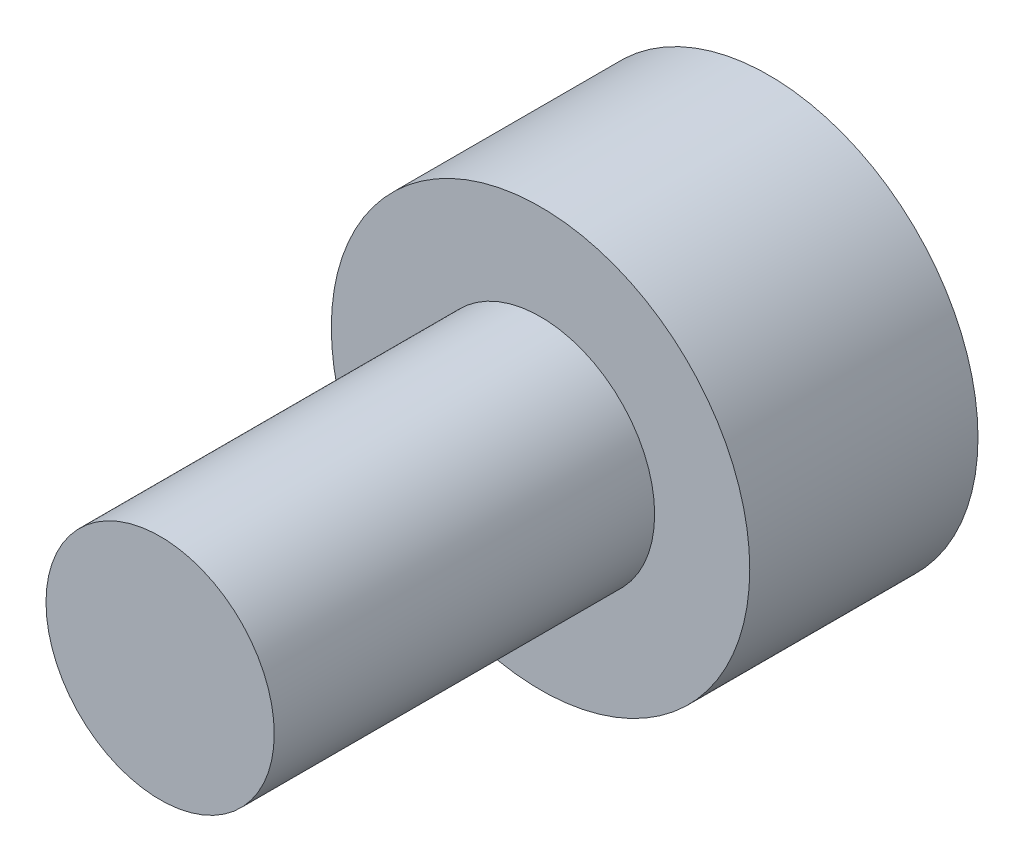
ISO-10303-21;
HEADER;
FILE_DESCRIPTION(('STEP AP214'),'2;1');
FILE_NAME('part.step','',(''),(''),'','','');
FILE_SCHEMA(('AUTOMOTIVE_DESIGN { 1 0 10303 214 1 1 1 1 }'));
ENDSEC;
DATA;
#1=APPLICATION_CONTEXT('core data for automotive mechanical design processes');
#2=APPLICATION_PROTOCOL_DEFINITION('international standard','automotive_design',2000,#1);
#3=PRODUCT_CONTEXT('',#1,'mechanical');
#4=PRODUCT('Part','Part','',(#3));
#5=PRODUCT_RELATED_PRODUCT_CATEGORY('part','',(#4));
#6=PRODUCT_DEFINITION_FORMATION('','',#4);
#7=PRODUCT_DEFINITION_CONTEXT('part definition',#1,'design');
#8=PRODUCT_DEFINITION('design','',#6,#7);
#9=PRODUCT_DEFINITION_SHAPE('','',#8);
#10=(LENGTH_UNIT() NAMED_UNIT(*) SI_UNIT(.MILLI.,.METRE.));
#11=(NAMED_UNIT(*) PLANE_ANGLE_UNIT() SI_UNIT($,.RADIAN.));
#12=(NAMED_UNIT(*) SI_UNIT($,.STERADIAN.) SOLID_ANGLE_UNIT());
#13=UNCERTAINTY_MEASURE_WITH_UNIT(LENGTH_MEASURE(1.E-05),#10,'distance_accuracy_value','');
#14=(GEOMETRIC_REPRESENTATION_CONTEXT(3) GLOBAL_UNCERTAINTY_ASSIGNED_CONTEXT((#13)) GLOBAL_UNIT_ASSIGNED_CONTEXT((#10,
#11,#12)) REPRESENTATION_CONTEXT('',''));
#15=CARTESIAN_POINT('',(0.,0.,0.));
#16=DIRECTION('',(0.,0.,1.));
#17=DIRECTION('',(1.,0.,0.));
#18=AXIS2_PLACEMENT_3D('',#15,#16,#17);
#19=CARTESIAN_POINT('',(0.,0.,-5.));
#20=DIRECTION('',(0.,0.,1.));
#21=DIRECTION('',(1.,0.,0.));
#22=AXIS2_PLACEMENT_3D('',#19,#20,#21);
#23=CYLINDRICAL_SURFACE('',#22,1.5);
#24=CARTESIAN_POINT('',(0.,0.,-5.));
#25=DIRECTION('',(0.,0.,-1.));
#26=DIRECTION('',(-1.,0.,0.));
#27=AXIS2_PLACEMENT_3D('',#24,#25,#26);
#28=CIRCLE('',#27,1.5);
#29=CARTESIAN_POINT('',(-1.5,0.,-5.));
#30=VERTEX_POINT('',#29);
#31=EDGE_CURVE('E41',#30,#30,#28,.F.);
#32=ORIENTED_EDGE('',*,*,#31,.T.);
#33=EDGE_LOOP('',(#32));
#34=FACE_BOUND('',#33,.T.);
#35=CARTESIAN_POINT('',(0.,0.,0.));
#36=DIRECTION('',(0.,0.,1.));
#37=DIRECTION('',(1.,0.,0.));
#38=AXIS2_PLACEMENT_3D('',#35,#36,#37);
#39=CIRCLE('',#38,1.5);
#40=CARTESIAN_POINT('',(1.5,0.,0.));
#41=VERTEX_POINT('',#40);
#42=EDGE_CURVE('E11',#41,#41,#39,.T.);
#43=ORIENTED_EDGE('',*,*,#42,.F.);
#44=EDGE_LOOP('',(#43));
#45=FACE_BOUND('',#44,.T.);
#46=ADVANCED_FACE('F34',(#34,#45),#23,.T.);
#47=CARTESIAN_POINT('',(0.,0.,0.));
#48=DIRECTION('',(0.,0.,1.));
#49=DIRECTION('',(1.,0.,0.));
#50=AXIS2_PLACEMENT_3D('',#47,#48,#49);
#51=PLANE('',#50);
#52=ORIENTED_EDGE('',*,*,#42,.T.);
#53=EDGE_LOOP('',(#52));
#54=FACE_BOUND('',#53,.T.);
#55=ADVANCED_FACE('F160',(#54),#51,.T.);
#56=CARTESIAN_POINT('',(0.,0.,-8.));
#57=DIRECTION('',(0.,0.,1.));
#58=DIRECTION('',(1.,0.,0.));
#59=AXIS2_PLACEMENT_3D('',#56,#57,#58);
#60=CYLINDRICAL_SURFACE('',#59,2.75);
#61=CARTESIAN_POINT('',(0.,0.,-8.));
#62=DIRECTION('',(0.,0.,-1.));
#63=DIRECTION('',(-1.,0.,0.));
#64=AXIS2_PLACEMENT_3D('',#61,#62,#63);
#65=CIRCLE('',#64,2.75);
#66=CARTESIAN_POINT('',(-2.75,0.,-8.));
#67=VERTEX_POINT('',#66);
#68=EDGE_CURVE('E141',#67,#67,#65,.T.);
#69=ORIENTED_EDGE('',*,*,#68,.F.);
#70=EDGE_LOOP('',(#69));
#71=FACE_BOUND('',#70,.T.);
#72=CARTESIAN_POINT('',(0.,0.,-5.));
#73=DIRECTION('',(0.,0.,-1.));
#74=DIRECTION('',(-1.,0.,0.));
#75=AXIS2_PLACEMENT_3D('',#72,#73,#74);
#76=CIRCLE('',#75,2.75);
#77=CARTESIAN_POINT('',(-2.75,0.,-5.));
#78=VERTEX_POINT('',#77);
#79=EDGE_CURVE('E135',#78,#78,#76,.T.);
#80=ORIENTED_EDGE('',*,*,#79,.T.);
#81=EDGE_LOOP('',(#80));
#82=FACE_BOUND('',#81,.T.);
#83=ADVANCED_FACE('F158',(#71,#82),#60,.T.);
#84=CARTESIAN_POINT('',(0.,0.,-8.));
#85=DIRECTION('',(0.,0.,-1.));
#86=DIRECTION('',(-1.,0.,0.));
#87=AXIS2_PLACEMENT_3D('',#84,#85,#86);
#88=PLANE('',#87);
#89=DIRECTION('',(0.866025403784439,0.5,0.));
#90=VECTOR('',#89,1.);
#91=CARTESIAN_POINT('',(-1.25,0.721687836487032,-8.));
#92=LINE('',#91,#90);
#93=CARTESIAN_POINT('',(-1.25,0.721687836487032,-8.));
#94=VERTEX_POINT('',#93);
#95=CARTESIAN_POINT('',(0.,1.44337567297406,-8.));
#96=VERTEX_POINT('',#95);
#97=EDGE_CURVE('E48',#94,#96,#92,.T.);
#98=ORIENTED_EDGE('',*,*,#97,.F.);
#99=DIRECTION('',(0.,1.,0.));
#100=VECTOR('',#99,1.);
#101=CARTESIAN_POINT('',(-1.25,-0.721687836487032,-8.));
#102=LINE('',#101,#100);
#103=CARTESIAN_POINT('',(-1.25,-0.721687836487032,-8.));
#104=VERTEX_POINT('',#103);
#105=EDGE_CURVE('E131',#104,#94,#102,.T.);
#106=ORIENTED_EDGE('',*,*,#105,.F.);
#107=DIRECTION('',(-0.866025403784439,0.5,0.));
#108=VECTOR('',#107,1.);
#109=CARTESIAN_POINT('',(0.,-1.44337567297406,-8.));
#110=LINE('',#109,#108);
#111=CARTESIAN_POINT('',(0.,-1.44337567297406,-8.));
#112=VERTEX_POINT('',#111);
#113=EDGE_CURVE('E129',#112,#104,#110,.T.);
#114=ORIENTED_EDGE('',*,*,#113,.F.);
#115=DIRECTION('',(-0.866025403784439,-0.5,0.));
#116=VECTOR('',#115,1.);
#117=CARTESIAN_POINT('',(1.25,-0.721687836487033,-8.));
#118=LINE('',#117,#116);
#119=CARTESIAN_POINT('',(1.25,-0.721687836487033,-8.));
#120=VERTEX_POINT('',#119);
#121=EDGE_CURVE('E96',#120,#112,#118,.T.);
#122=ORIENTED_EDGE('',*,*,#121,.F.);
#123=DIRECTION('',(0.,-1.,0.));
#124=VECTOR('',#123,1.);
#125=CARTESIAN_POINT('',(1.25,0.721687836487032,-8.));
#126=LINE('',#125,#124);
#127=CARTESIAN_POINT('',(1.25,0.721687836487032,-8.));
#128=VERTEX_POINT('',#127);
#129=EDGE_CURVE('E125',#128,#120,#126,.T.);
#130=ORIENTED_EDGE('',*,*,#129,.F.);
#131=DIRECTION('',(0.866025403784439,-0.5,0.));
#132=VECTOR('',#131,1.);
#133=CARTESIAN_POINT('',(0.,1.44337567297406,-8.));
#134=LINE('',#133,#132);
#135=EDGE_CURVE('E122',#96,#128,#134,.T.);
#136=ORIENTED_EDGE('',*,*,#135,.F.);
#137=EDGE_LOOP('',(#98,#106,#114,#122,#130,#136));
#138=FACE_BOUND('',#137,.T.);
#139=ORIENTED_EDGE('',*,*,#68,.T.);
#140=EDGE_LOOP('',(#139));
#141=FACE_BOUND('',#140,.T.);
#142=ADVANCED_FACE('F154',(#138,#141),#88,.T.);
#143=CARTESIAN_POINT('',(0.,0.,-5.));
#144=DIRECTION('',(0.,0.,-1.));
#145=DIRECTION('',(-1.,0.,0.));
#146=AXIS2_PLACEMENT_3D('',#143,#144,#145);
#147=PLANE('',#146);
#148=ORIENTED_EDGE('',*,*,#31,.F.);
#149=EDGE_LOOP('',(#148));
#150=FACE_BOUND('',#149,.T.);
#151=ORIENTED_EDGE('',*,*,#79,.F.);
#152=EDGE_LOOP('',(#151));
#153=FACE_BOUND('',#152,.T.);
#154=ADVANCED_FACE('F150',(#150,#153),#147,.F.);
#155=CARTESIAN_POINT('',(-1.25,0.721687836487032,-6.125));
#156=DIRECTION('',(-0.5,0.866025403784439,0.));
#157=DIRECTION('',(-0.866025403784439,-0.5,0.));
#158=AXIS2_PLACEMENT_3D('',#155,#156,#157);
#159=PLANE('',#158);
#160=ORIENTED_EDGE('',*,*,#97,.T.);
#161=DIRECTION('',(0.,0.,-1.));
#162=VECTOR('',#161,1.);
#163=CARTESIAN_POINT('',(0.,1.44337567297406,-6.125));
#164=LINE('',#163,#162);
#165=CARTESIAN_POINT('',(0.,1.44337567297406,-6.125));
#166=VERTEX_POINT('',#165);
#167=EDGE_CURVE('E78',#166,#96,#164,.T.);
#168=ORIENTED_EDGE('',*,*,#167,.F.);
#169=DIRECTION('',(0.866025403784439,0.5,0.));
#170=VECTOR('',#169,1.);
#171=CARTESIAN_POINT('',(-1.25,0.721687836487032,-6.125));
#172=LINE('',#171,#170);
#173=CARTESIAN_POINT('',(-1.25,0.721687836487032,-6.125));
#174=VERTEX_POINT('',#173);
#175=EDGE_CURVE('E133',#174,#166,#172,.T.);
#176=ORIENTED_EDGE('',*,*,#175,.F.);
#177=DIRECTION('',(0.,0.,-1.));
#178=VECTOR('',#177,1.);
#179=CARTESIAN_POINT('',(-1.25,0.721687836487032,-6.125));
#180=LINE('',#179,#178);
#181=EDGE_CURVE('E56',#174,#94,#180,.T.);
#182=ORIENTED_EDGE('',*,*,#181,.T.);
#183=EDGE_LOOP('',(#160,#168,#176,#182));
#184=FACE_BOUND('',#183,.T.);
#185=ADVANCED_FACE('F153',(#184),#159,.F.);
#186=CARTESIAN_POINT('',(-1.25,-0.721687836487032,-6.125));
#187=DIRECTION('',(-1.,0.,0.));
#188=DIRECTION('',(0.,-1.,0.));
#189=AXIS2_PLACEMENT_3D('',#186,#187,#188);
#190=PLANE('',#189);
#191=ORIENTED_EDGE('',*,*,#105,.T.);
#192=ORIENTED_EDGE('',*,*,#181,.F.);
#193=DIRECTION('',(0.,1.,0.));
#194=VECTOR('',#193,1.);
#195=CARTESIAN_POINT('',(-1.25,-0.721687836487032,-6.125));
#196=LINE('',#195,#194);
#197=CARTESIAN_POINT('',(-1.25,-0.721687836487032,-6.125));
#198=VERTEX_POINT('',#197);
#199=EDGE_CURVE('E108',#198,#174,#196,.T.);
#200=ORIENTED_EDGE('',*,*,#199,.F.);
#201=DIRECTION('',(0.,0.,-1.));
#202=VECTOR('',#201,1.);
#203=CARTESIAN_POINT('',(-1.25,-0.721687836487032,-6.125));
#204=LINE('',#203,#202);
#205=EDGE_CURVE('E100',#198,#104,#204,.T.);
#206=ORIENTED_EDGE('',*,*,#205,.T.);
#207=EDGE_LOOP('',(#191,#192,#200,#206));
#208=FACE_BOUND('',#207,.T.);
#209=ADVANCED_FACE('F203',(#208),#190,.F.);
#210=CARTESIAN_POINT('',(0.,-1.44337567297406,-6.125));
#211=DIRECTION('',(-0.5,-0.866025403784439,0.));
#212=DIRECTION('',(0.866025403784439,-0.5,0.));
#213=AXIS2_PLACEMENT_3D('',#210,#211,#212);
#214=PLANE('',#213);
#215=ORIENTED_EDGE('',*,*,#113,.T.);
#216=ORIENTED_EDGE('',*,*,#205,.F.);
#217=DIRECTION('',(-0.866025403784439,0.5,0.));
#218=VECTOR('',#217,1.);
#219=CARTESIAN_POINT('',(0.,-1.44337567297406,-6.125));
#220=LINE('',#219,#218);
#221=CARTESIAN_POINT('',(0.,-1.44337567297406,-6.125));
#222=VERTEX_POINT('',#221);
#223=EDGE_CURVE('E104',#222,#198,#220,.T.);
#224=ORIENTED_EDGE('',*,*,#223,.F.);
#225=DIRECTION('',(0.,0.,-1.));
#226=VECTOR('',#225,1.);
#227=CARTESIAN_POINT('',(0.,-1.44337567297406,-6.125));
#228=LINE('',#227,#226);
#229=EDGE_CURVE('E89',#222,#112,#228,.T.);
#230=ORIENTED_EDGE('',*,*,#229,.T.);
#231=EDGE_LOOP('',(#215,#216,#224,#230));
#232=FACE_BOUND('',#231,.T.);
#233=ADVANCED_FACE('F105',(#232),#214,.F.);
#234=CARTESIAN_POINT('',(1.25,-0.721687836487033,-6.125));
#235=DIRECTION('',(0.5,-0.866025403784439,0.));
#236=DIRECTION('',(0.866025403784439,0.5,0.));
#237=AXIS2_PLACEMENT_3D('',#234,#235,#236);
#238=PLANE('',#237);
#239=ORIENTED_EDGE('',*,*,#121,.T.);
#240=ORIENTED_EDGE('',*,*,#229,.F.);
#241=DIRECTION('',(-0.866025403784439,-0.5,0.));
#242=VECTOR('',#241,1.);
#243=CARTESIAN_POINT('',(1.25,-0.721687836487033,-6.125));
#244=LINE('',#243,#242);
#245=CARTESIAN_POINT('',(1.25,-0.721687836487033,-6.125));
#246=VERTEX_POINT('',#245);
#247=EDGE_CURVE('E93',#246,#222,#244,.T.);
#248=ORIENTED_EDGE('',*,*,#247,.F.);
#249=DIRECTION('',(0.,0.,-1.));
#250=VECTOR('',#249,1.);
#251=CARTESIAN_POINT('',(1.25,-0.721687836487033,-6.125));
#252=LINE('',#251,#250);
#253=EDGE_CURVE('E101',#246,#120,#252,.T.);
#254=ORIENTED_EDGE('',*,*,#253,.T.);
#255=EDGE_LOOP('',(#239,#240,#248,#254));
#256=FACE_BOUND('',#255,.T.);
#257=ADVANCED_FACE('F91',(#256),#238,.F.);
#258=CARTESIAN_POINT('',(1.25,0.721687836487032,-6.125));
#259=DIRECTION('',(1.,0.,0.));
#260=DIRECTION('',(0.,0.,-1.));
#261=AXIS2_PLACEMENT_3D('',#258,#259,#260);
#262=PLANE('',#261);
#263=ORIENTED_EDGE('',*,*,#129,.T.);
#264=ORIENTED_EDGE('',*,*,#253,.F.);
#265=DIRECTION('',(0.,-1.,0.));
#266=VECTOR('',#265,1.);
#267=CARTESIAN_POINT('',(1.25,0.721687836487032,-6.125));
#268=LINE('',#267,#266);
#269=CARTESIAN_POINT('',(1.25,0.721687836487032,-6.125));
#270=VERTEX_POINT('',#269);
#271=EDGE_CURVE('E114',#270,#246,#268,.T.);
#272=ORIENTED_EDGE('',*,*,#271,.F.);
#273=DIRECTION('',(0.,0.,-1.));
#274=VECTOR('',#273,1.);
#275=CARTESIAN_POINT('',(1.25,0.721687836487032,-6.125));
#276=LINE('',#275,#274);
#277=EDGE_CURVE('E138',#270,#128,#276,.T.);
#278=ORIENTED_EDGE('',*,*,#277,.T.);
#279=EDGE_LOOP('',(#263,#264,#272,#278));
#280=FACE_BOUND('',#279,.T.);
#281=ADVANCED_FACE('F228',(#280),#262,.F.);
#282=CARTESIAN_POINT('',(0.,1.44337567297406,-6.125));
#283=DIRECTION('',(0.5,0.866025403784439,0.));
#284=DIRECTION('',(-0.866025403784439,0.5,0.));
#285=AXIS2_PLACEMENT_3D('',#282,#283,#284);
#286=PLANE('',#285);
#287=ORIENTED_EDGE('',*,*,#135,.T.);
#288=ORIENTED_EDGE('',*,*,#277,.F.);
#289=DIRECTION('',(0.866025403784439,-0.5,0.));
#290=VECTOR('',#289,1.);
#291=CARTESIAN_POINT('',(0.,1.44337567297406,-6.125));
#292=LINE('',#291,#290);
#293=EDGE_CURVE('E116',#166,#270,#292,.T.);
#294=ORIENTED_EDGE('',*,*,#293,.F.);
#295=ORIENTED_EDGE('',*,*,#167,.T.);
#296=EDGE_LOOP('',(#287,#288,#294,#295));
#297=FACE_BOUND('',#296,.T.);
#298=ADVANCED_FACE('F237',(#297),#286,.F.);
#299=CARTESIAN_POINT('',(1.25,2.1650635094611,-6.125));
#300=DIRECTION('',(0.,0.,-1.));
#301=DIRECTION('',(-1.,0.,0.));
#302=AXIS2_PLACEMENT_3D('',#299,#300,#301);
#303=PLANE('',#302);
#304=ORIENTED_EDGE('',*,*,#175,.T.);
#305=ORIENTED_EDGE('',*,*,#293,.T.);
#306=ORIENTED_EDGE('',*,*,#271,.T.);
#307=ORIENTED_EDGE('',*,*,#247,.T.);
#308=ORIENTED_EDGE('',*,*,#223,.T.);
#309=ORIENTED_EDGE('',*,*,#199,.T.);
#310=EDGE_LOOP('',(#304,#305,#306,#307,#308,#309));
#311=FACE_BOUND('',#310,.T.);
#312=ADVANCED_FACE('F111',(#311),#303,.T.);
#313=CLOSED_SHELL('',(#46,#55,#83,#142,#154,#185,#209,#233,#257,#281,#298,#312));
#314=MANIFOLD_SOLID_BREP('B2',#313);
#315=ADVANCED_BREP_SHAPE_REPRESENTATION('',(#18,#314),#14);
#316=SHAPE_DEFINITION_REPRESENTATION(#9,#315);
ENDSEC;
END-ISO-10303-21;
